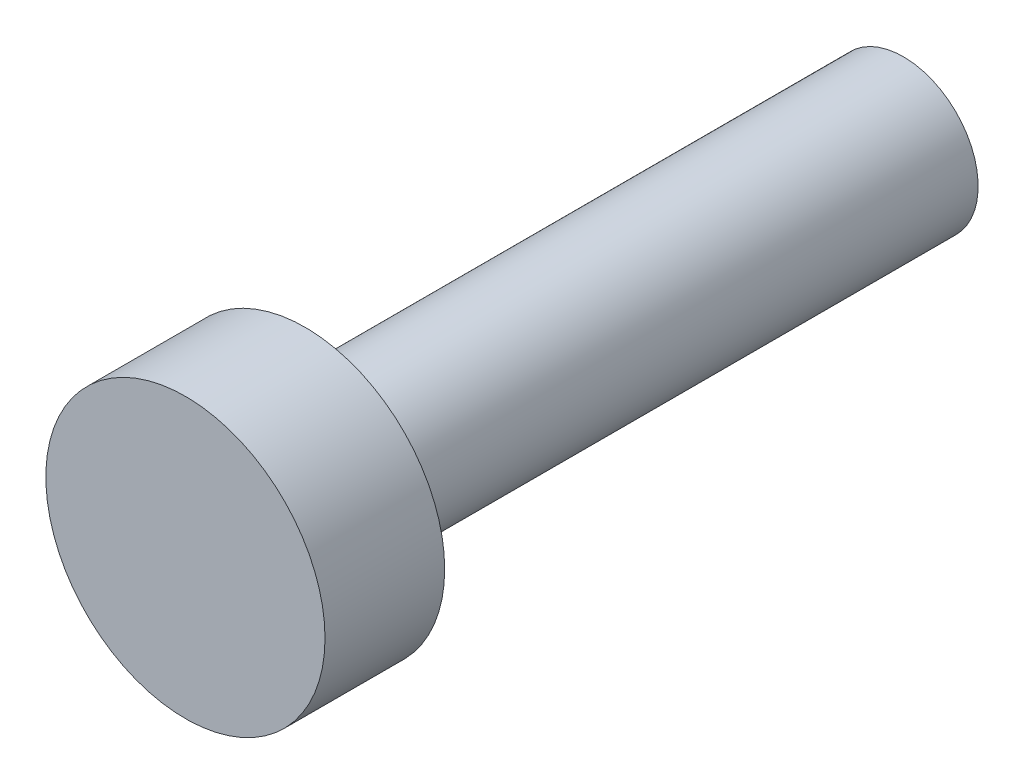
ISO-10303-21;
HEADER;
FILE_DESCRIPTION(('STEP AP214'),'2;1');
FILE_NAME('part.step','',(''),(''),'','','');
FILE_SCHEMA(('AUTOMOTIVE_DESIGN { 1 0 10303 214 1 1 1 1 }'));
ENDSEC;
DATA;
#1=APPLICATION_CONTEXT('core data for automotive mechanical design processes');
#2=APPLICATION_PROTOCOL_DEFINITION('international standard','automotive_design',2000,#1);
#3=PRODUCT_CONTEXT('',#1,'mechanical');
#4=PRODUCT('Part','Part','',(#3));
#5=PRODUCT_RELATED_PRODUCT_CATEGORY('part','',(#4));
#6=PRODUCT_DEFINITION_FORMATION('','',#4);
#7=PRODUCT_DEFINITION_CONTEXT('part definition',#1,'design');
#8=PRODUCT_DEFINITION('design','',#6,#7);
#9=PRODUCT_DEFINITION_SHAPE('','',#8);
#10=(LENGTH_UNIT() NAMED_UNIT(*) SI_UNIT(.MILLI.,.METRE.));
#11=(NAMED_UNIT(*) PLANE_ANGLE_UNIT() SI_UNIT($,.RADIAN.));
#12=(NAMED_UNIT(*) SI_UNIT($,.STERADIAN.) SOLID_ANGLE_UNIT());
#13=UNCERTAINTY_MEASURE_WITH_UNIT(LENGTH_MEASURE(1.E-05),#10,'distance_accuracy_value','');
#14=(GEOMETRIC_REPRESENTATION_CONTEXT(3) GLOBAL_UNCERTAINTY_ASSIGNED_CONTEXT((#13)) GLOBAL_UNIT_ASSIGNED_CONTEXT((#10,
#11,#12)) REPRESENTATION_CONTEXT('',''));
#15=CARTESIAN_POINT('',(0.,0.,0.));
#16=DIRECTION('',(0.,0.,1.));
#17=DIRECTION('',(1.,0.,0.));
#18=AXIS2_PLACEMENT_3D('',#15,#16,#17);
#19=CARTESIAN_POINT('',(0.,0.,2.4));
#20=DIRECTION('',(0.,0.,-1.));
#21=DIRECTION('',(-1.,0.,0.));
#22=AXIS2_PLACEMENT_3D('',#19,#20,#21);
#23=CYLINDRICAL_SURFACE('',#22,2.8);
#24=CARTESIAN_POINT('',(0.,0.,2.4));
#25=DIRECTION('',(0.,0.,1.));
#26=DIRECTION('',(1.,0.,0.));
#27=AXIS2_PLACEMENT_3D('',#24,#25,#26);
#28=CIRCLE('',#27,2.8);
#29=CARTESIAN_POINT('',(2.8,0.,2.4));
#30=VERTEX_POINT('',#29);
#31=EDGE_CURVE('E37',#30,#30,#28,.T.);
#32=ORIENTED_EDGE('',*,*,#31,.F.);
#33=EDGE_LOOP('',(#32));
#34=FACE_BOUND('',#33,.T.);
#35=CARTESIAN_POINT('',(0.,0.,0.));
#36=DIRECTION('',(0.,0.,1.));
#37=DIRECTION('',(1.,0.,0.));
#38=AXIS2_PLACEMENT_3D('',#35,#36,#37);
#39=CIRCLE('',#38,2.8);
#40=CARTESIAN_POINT('',(2.8,0.,0.));
#41=VERTEX_POINT('',#40);
#42=EDGE_CURVE('E33',#41,#41,#39,.T.);
#43=ORIENTED_EDGE('',*,*,#42,.T.);
#44=EDGE_LOOP('',(#43));
#45=FACE_BOUND('',#44,.T.);
#46=ADVANCED_FACE('F30',(#34,#45),#23,.T.);
#47=CARTESIAN_POINT('',(0.,0.,2.4));
#48=DIRECTION('',(0.,0.,1.));
#49=DIRECTION('',(1.,0.,0.));
#50=AXIS2_PLACEMENT_3D('',#47,#48,#49);
#51=PLANE('',#50);
#52=ORIENTED_EDGE('',*,*,#31,.T.);
#53=EDGE_LOOP('',(#52));
#54=FACE_BOUND('',#53,.T.);
#55=ADVANCED_FACE('F54',(#54),#51,.T.);
#56=CARTESIAN_POINT('',(0.,0.,0.));
#57=DIRECTION('',(0.,0.,1.));
#58=DIRECTION('',(1.,0.,0.));
#59=AXIS2_PLACEMENT_3D('',#56,#57,#58);
#60=PLANE('',#59);
#61=CARTESIAN_POINT('',(0.,0.,0.));
#62=DIRECTION('',(0.,0.,-1.));
#63=DIRECTION('',(-1.,0.,0.));
#64=AXIS2_PLACEMENT_3D('',#61,#62,#63);
#65=CIRCLE('',#64,1.5);
#66=CARTESIAN_POINT('',(-1.5,0.,0.));
#67=VERTEX_POINT('',#66);
#68=EDGE_CURVE('E10',#67,#67,#65,.T.);
#69=ORIENTED_EDGE('',*,*,#68,.F.);
#70=EDGE_LOOP('',(#69));
#71=FACE_BOUND('',#70,.T.);
#72=ORIENTED_EDGE('',*,*,#42,.F.);
#73=EDGE_LOOP('',(#72));
#74=FACE_BOUND('',#73,.T.);
#75=ADVANCED_FACE('F51',(#71,#74),#60,.F.);
#76=CARTESIAN_POINT('',(0.,0.,-12.));
#77=DIRECTION('',(0.,0.,1.));
#78=DIRECTION('',(1.,0.,0.));
#79=AXIS2_PLACEMENT_3D('',#76,#77,#78);
#80=CYLINDRICAL_SURFACE('',#79,1.5);
#81=CARTESIAN_POINT('',(0.,0.,-12.));
#82=DIRECTION('',(0.,0.,-1.));
#83=DIRECTION('',(-1.,0.,0.));
#84=AXIS2_PLACEMENT_3D('',#81,#82,#83);
#85=CIRCLE('',#84,1.5);
#86=CARTESIAN_POINT('',(-1.5,0.,-12.));
#87=VERTEX_POINT('',#86);
#88=EDGE_CURVE('E43',#87,#87,#85,.T.);
#89=ORIENTED_EDGE('',*,*,#88,.F.);
#90=EDGE_LOOP('',(#89));
#91=FACE_BOUND('',#90,.T.);
#92=ORIENTED_EDGE('',*,*,#68,.T.);
#93=EDGE_LOOP('',(#92));
#94=FACE_BOUND('',#93,.T.);
#95=ADVANCED_FACE('F53',(#91,#94),#80,.T.);
#96=CARTESIAN_POINT('',(0.,0.,-12.));
#97=DIRECTION('',(0.,0.,-1.));
#98=DIRECTION('',(-1.,0.,0.));
#99=AXIS2_PLACEMENT_3D('',#96,#97,#98);
#100=PLANE('',#99);
#101=ORIENTED_EDGE('',*,*,#88,.T.);
#102=EDGE_LOOP('',(#101));
#103=FACE_BOUND('',#102,.T.);
#104=ADVANCED_FACE('F60',(#103),#100,.T.);
#105=CLOSED_SHELL('',(#46,#55,#75,#95,#104));
#106=MANIFOLD_SOLID_BREP('B2',#105);
#107=ADVANCED_BREP_SHAPE_REPRESENTATION('',(#18,#106),#14);
#108=SHAPE_DEFINITION_REPRESENTATION(#9,#107);
ENDSEC;
END-ISO-10303-21;
